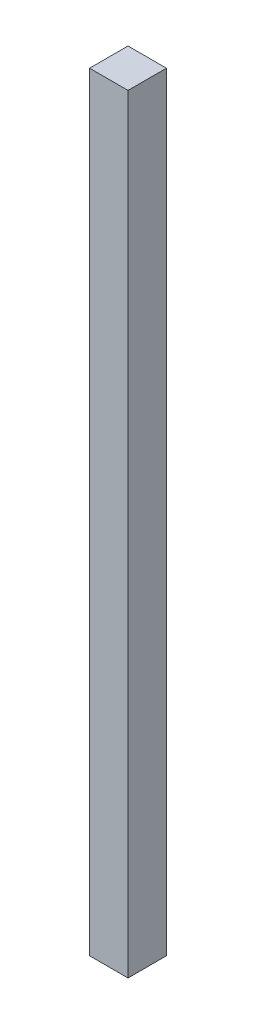
ISO-10303-21;
HEADER;
FILE_DESCRIPTION(('STEP AP214'),'2;1');
FILE_NAME('part.step','',(''),(''),'','','');
FILE_SCHEMA(('AUTOMOTIVE_DESIGN { 1 0 10303 214 1 1 1 1 }'));
ENDSEC;
DATA;
#1=APPLICATION_CONTEXT('core data for automotive mechanical design processes');
#2=APPLICATION_PROTOCOL_DEFINITION('international standard','automotive_design',2000,#1);
#3=PRODUCT_CONTEXT('',#1,'mechanical');
#4=PRODUCT('Part','Part','',(#3));
#5=PRODUCT_RELATED_PRODUCT_CATEGORY('part','',(#4));
#6=PRODUCT_DEFINITION_FORMATION('','',#4);
#7=PRODUCT_DEFINITION_CONTEXT('part definition',#1,'design');
#8=PRODUCT_DEFINITION('design','',#6,#7);
#9=PRODUCT_DEFINITION_SHAPE('','',#8);
#10=(LENGTH_UNIT() NAMED_UNIT(*) SI_UNIT(.MILLI.,.METRE.));
#11=(NAMED_UNIT(*) PLANE_ANGLE_UNIT() SI_UNIT($,.RADIAN.));
#12=(NAMED_UNIT(*) SI_UNIT($,.STERADIAN.) SOLID_ANGLE_UNIT());
#13=UNCERTAINTY_MEASURE_WITH_UNIT(LENGTH_MEASURE(1.E-05),#10,'distance_accuracy_value','');
#14=(GEOMETRIC_REPRESENTATION_CONTEXT(3) GLOBAL_UNCERTAINTY_ASSIGNED_CONTEXT((#13)) GLOBAL_UNIT_ASSIGNED_CONTEXT((#10,
#11,#12)) REPRESENTATION_CONTEXT('',''));
#15=CARTESIAN_POINT('',(0.,0.,0.));
#16=DIRECTION('',(0.,0.,1.));
#17=DIRECTION('',(1.,0.,0.));
#18=AXIS2_PLACEMENT_3D('',#15,#16,#17);
#19=CARTESIAN_POINT('',(10.,400.,10.));
#20=DIRECTION('',(-1.,0.,0.));
#21=DIRECTION('',(0.,0.,1.));
#22=AXIS2_PLACEMENT_3D('',#19,#20,#21);
#23=PLANE('',#22);
#24=DIRECTION('',(0.,0.,-1.));
#25=VECTOR('',#24,1.);
#26=CARTESIAN_POINT('',(10.,0.,10.));
#27=LINE('',#26,#25);
#28=CARTESIAN_POINT('',(10.,0.,10.));
#29=VERTEX_POINT('',#28);
#30=CARTESIAN_POINT('',(10.,0.,-10.));
#31=VERTEX_POINT('',#30);
#32=EDGE_CURVE('E95',#29,#31,#27,.T.);
#33=ORIENTED_EDGE('',*,*,#32,.T.);
#34=DIRECTION('',(0.,-1.,0.));
#35=VECTOR('',#34,1.);
#36=CARTESIAN_POINT('',(10.,400.,-10.));
#37=LINE('',#36,#35);
#38=CARTESIAN_POINT('',(10.,400.,-10.));
#39=VERTEX_POINT('',#38);
#40=EDGE_CURVE('E11',#39,#31,#37,.T.);
#41=ORIENTED_EDGE('',*,*,#40,.F.);
#42=DIRECTION('',(0.,0.,-1.));
#43=VECTOR('',#42,1.);
#44=CARTESIAN_POINT('',(10.,400.,10.));
#45=LINE('',#44,#43);
#46=CARTESIAN_POINT('',(10.,400.,10.));
#47=VERTEX_POINT('',#46);
#48=EDGE_CURVE('E83',#47,#39,#45,.T.);
#49=ORIENTED_EDGE('',*,*,#48,.F.);
#50=DIRECTION('',(0.,-1.,0.));
#51=VECTOR('',#50,1.);
#52=CARTESIAN_POINT('',(10.,400.,10.));
#53=LINE('',#52,#51);
#54=EDGE_CURVE('E91',#47,#29,#53,.T.);
#55=ORIENTED_EDGE('',*,*,#54,.T.);
#56=EDGE_LOOP('',(#33,#41,#49,#55));
#57=FACE_BOUND('',#56,.T.);
#58=ADVANCED_FACE('F32',(#57),#23,.F.);
#59=CARTESIAN_POINT('',(-10.,400.,-10.));
#60=DIRECTION('',(0.,0.,1.));
#61=DIRECTION('',(1.,0.,0.));
#62=AXIS2_PLACEMENT_3D('',#59,#60,#61);
#63=PLANE('',#62);
#64=DIRECTION('',(-1.,0.,0.));
#65=VECTOR('',#64,1.);
#66=CARTESIAN_POINT('',(-10.,0.,-10.));
#67=LINE('',#66,#65);
#68=CARTESIAN_POINT('',(-10.,0.,-10.));
#69=VERTEX_POINT('',#68);
#70=EDGE_CURVE('E87',#31,#69,#67,.T.);
#71=ORIENTED_EDGE('',*,*,#70,.T.);
#72=DIRECTION('',(0.,-1.,0.));
#73=VECTOR('',#72,1.);
#74=CARTESIAN_POINT('',(-10.,400.,-10.));
#75=LINE('',#74,#73);
#76=CARTESIAN_POINT('',(-10.,400.,-10.));
#77=VERTEX_POINT('',#76);
#78=EDGE_CURVE('E40',#77,#69,#75,.T.);
#79=ORIENTED_EDGE('',*,*,#78,.F.);
#80=DIRECTION('',(-1.,0.,0.));
#81=VECTOR('',#80,1.);
#82=CARTESIAN_POINT('',(-10.,400.,-10.));
#83=LINE('',#82,#81);
#84=EDGE_CURVE('E78',#39,#77,#83,.T.);
#85=ORIENTED_EDGE('',*,*,#84,.F.);
#86=ORIENTED_EDGE('',*,*,#40,.T.);
#87=EDGE_LOOP('',(#71,#79,#85,#86));
#88=FACE_BOUND('',#87,.T.);
#89=ADVANCED_FACE('F86',(#88),#63,.F.);
#90=CARTESIAN_POINT('',(-10.,400.,10.));
#91=DIRECTION('',(1.,0.,0.));
#92=DIRECTION('',(0.,0.,-1.));
#93=AXIS2_PLACEMENT_3D('',#90,#91,#92);
#94=PLANE('',#93);
#95=DIRECTION('',(0.,0.,1.));
#96=VECTOR('',#95,1.);
#97=CARTESIAN_POINT('',(-10.,0.,10.));
#98=LINE('',#97,#96);
#99=CARTESIAN_POINT('',(-10.,0.,10.));
#100=VERTEX_POINT('',#99);
#101=EDGE_CURVE('E65',#69,#100,#98,.T.);
#102=ORIENTED_EDGE('',*,*,#101,.T.);
#103=DIRECTION('',(0.,-1.,0.));
#104=VECTOR('',#103,1.);
#105=CARTESIAN_POINT('',(-10.,400.,10.));
#106=LINE('',#105,#104);
#107=CARTESIAN_POINT('',(-10.,400.,10.));
#108=VERTEX_POINT('',#107);
#109=EDGE_CURVE('E88',#108,#100,#106,.T.);
#110=ORIENTED_EDGE('',*,*,#109,.F.);
#111=DIRECTION('',(0.,0.,1.));
#112=VECTOR('',#111,1.);
#113=CARTESIAN_POINT('',(-10.,400.,10.));
#114=LINE('',#113,#112);
#115=EDGE_CURVE('E81',#77,#108,#114,.T.);
#116=ORIENTED_EDGE('',*,*,#115,.F.);
#117=ORIENTED_EDGE('',*,*,#78,.T.);
#118=EDGE_LOOP('',(#102,#110,#116,#117));
#119=FACE_BOUND('',#118,.T.);
#120=ADVANCED_FACE('F89',(#119),#94,.F.);
#121=CARTESIAN_POINT('',(-10.,400.,10.));
#122=DIRECTION('',(0.,0.,-1.));
#123=DIRECTION('',(-1.,0.,0.));
#124=AXIS2_PLACEMENT_3D('',#121,#122,#123);
#125=PLANE('',#124);
#126=DIRECTION('',(1.,0.,0.));
#127=VECTOR('',#126,1.);
#128=CARTESIAN_POINT('',(-10.,0.,10.));
#129=LINE('',#128,#127);
#130=EDGE_CURVE('E71',#100,#29,#129,.T.);
#131=ORIENTED_EDGE('',*,*,#130,.T.);
#132=ORIENTED_EDGE('',*,*,#54,.F.);
#133=DIRECTION('',(1.,0.,0.));
#134=VECTOR('',#133,1.);
#135=CARTESIAN_POINT('',(-10.,400.,10.));
#136=LINE('',#135,#134);
#137=EDGE_CURVE('E48',#108,#47,#136,.T.);
#138=ORIENTED_EDGE('',*,*,#137,.F.);
#139=ORIENTED_EDGE('',*,*,#109,.T.);
#140=EDGE_LOOP('',(#131,#132,#138,#139));
#141=FACE_BOUND('',#140,.T.);
#142=ADVANCED_FACE('F102',(#141),#125,.F.);
#143=CARTESIAN_POINT('',(0.,400.,0.));
#144=DIRECTION('',(0.,-1.,0.));
#145=DIRECTION('',(0.,0.,-1.));
#146=AXIS2_PLACEMENT_3D('',#143,#144,#145);
#147=PLANE('',#146);
#148=ORIENTED_EDGE('',*,*,#48,.T.);
#149=ORIENTED_EDGE('',*,*,#84,.T.);
#150=ORIENTED_EDGE('',*,*,#115,.T.);
#151=ORIENTED_EDGE('',*,*,#137,.T.);
#152=EDGE_LOOP('',(#148,#149,#150,#151));
#153=FACE_BOUND('',#152,.T.);
#154=ADVANCED_FACE('F79',(#153),#147,.F.);
#155=CARTESIAN_POINT('',(0.,0.,0.));
#156=DIRECTION('',(0.,-1.,0.));
#157=DIRECTION('',(0.,0.,-1.));
#158=AXIS2_PLACEMENT_3D('',#155,#156,#157);
#159=PLANE('',#158);
#160=ORIENTED_EDGE('',*,*,#32,.F.);
#161=ORIENTED_EDGE('',*,*,#130,.F.);
#162=ORIENTED_EDGE('',*,*,#101,.F.);
#163=ORIENTED_EDGE('',*,*,#70,.F.);
#164=EDGE_LOOP('',(#160,#161,#162,#163));
#165=FACE_BOUND('',#164,.T.);
#166=ADVANCED_FACE('F105',(#165),#159,.T.);
#167=CLOSED_SHELL('',(#58,#89,#120,#142,#154,#166));
#168=MANIFOLD_SOLID_BREP('B2',#167);
#169=ADVANCED_BREP_SHAPE_REPRESENTATION('',(#18,#168),#14);
#170=SHAPE_DEFINITION_REPRESENTATION(#9,#169);
ENDSEC;
END-ISO-10303-21;
